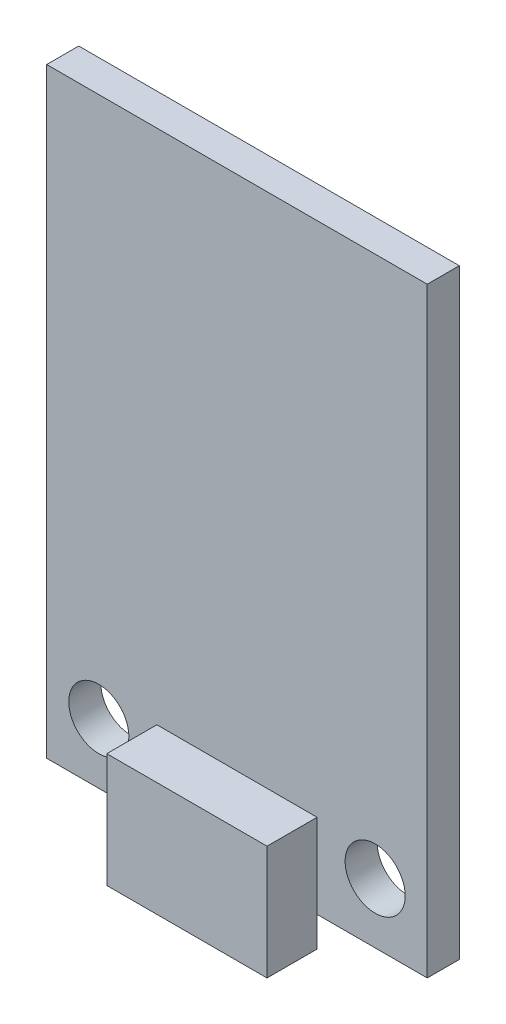
ISO-10303-21;
HEADER;
FILE_DESCRIPTION(('STEP AP214'),'2;1');
FILE_NAME('part.step','',(''),(''),'','','');
FILE_SCHEMA(('AUTOMOTIVE_DESIGN { 1 0 10303 214 1 1 1 1 }'));
ENDSEC;
DATA;
#1=APPLICATION_CONTEXT('core data for automotive mechanical design processes');
#2=APPLICATION_PROTOCOL_DEFINITION('international standard','automotive_design',2000,#1);
#3=PRODUCT_CONTEXT('',#1,'mechanical');
#4=PRODUCT('Part','Part','',(#3));
#5=PRODUCT_RELATED_PRODUCT_CATEGORY('part','',(#4));
#6=PRODUCT_DEFINITION_FORMATION('','',#4);
#7=PRODUCT_DEFINITION_CONTEXT('part definition',#1,'design');
#8=PRODUCT_DEFINITION('design','',#6,#7);
#9=PRODUCT_DEFINITION_SHAPE('','',#8);
#10=(LENGTH_UNIT() NAMED_UNIT(*) SI_UNIT(.MILLI.,.METRE.));
#11=(NAMED_UNIT(*) PLANE_ANGLE_UNIT() SI_UNIT($,.RADIAN.));
#12=(NAMED_UNIT(*) SI_UNIT($,.STERADIAN.) SOLID_ANGLE_UNIT());
#13=UNCERTAINTY_MEASURE_WITH_UNIT(LENGTH_MEASURE(1.E-05),#10,'distance_accuracy_value','');
#14=(GEOMETRIC_REPRESENTATION_CONTEXT(3) GLOBAL_UNCERTAINTY_ASSIGNED_CONTEXT((#13)) GLOBAL_UNIT_ASSIGNED_CONTEXT((#10,
#11,#12)) REPRESENTATION_CONTEXT('',''));
#15=CARTESIAN_POINT('',(0.,0.,0.));
#16=DIRECTION('',(0.,0.,1.));
#17=DIRECTION('',(1.,0.,0.));
#18=AXIS2_PLACEMENT_3D('',#15,#16,#17);
#19=CARTESIAN_POINT('',(0.,0.,1.6));
#20=DIRECTION('',(0.,0.,-1.));
#21=DIRECTION('',(-1.,0.,0.));
#22=AXIS2_PLACEMENT_3D('',#19,#20,#21);
#23=PLANE('',#22);
#24=CARTESIAN_POINT('',(16.4,3.,1.6));
#25=DIRECTION('',(0.,0.,1.));
#26=DIRECTION('',(1.,0.,0.));
#27=AXIS2_PLACEMENT_3D('',#24,#25,#26);
#28=CIRCLE('',#27,1.5);
#29=CARTESIAN_POINT('',(17.9,3.,1.6));
#30=VERTEX_POINT('',#29);
#31=EDGE_CURVE('E202',#30,#30,#28,.T.);
#32=ORIENTED_EDGE('',*,*,#31,.F.);
#33=EDGE_LOOP('',(#32));
#34=FACE_BOUND('',#33,.T.);
#35=CARTESIAN_POINT('',(2.6,3.,1.6));
#36=DIRECTION('',(0.,0.,1.));
#37=DIRECTION('',(-1.,0.,0.));
#38=AXIS2_PLACEMENT_3D('',#35,#36,#37);
#39=CIRCLE('',#38,1.5);
#40=CARTESIAN_POINT('',(1.1,3.,1.6));
#41=VERTEX_POINT('',#40);
#42=EDGE_CURVE('E209',#41,#41,#39,.T.);
#43=ORIENTED_EDGE('',*,*,#42,.F.);
#44=EDGE_LOOP('',(#43));
#45=FACE_BOUND('',#44,.T.);
#46=DIRECTION('',(0.,-1.,0.));
#47=VECTOR('',#46,1.);
#48=CARTESIAN_POINT('',(5.5,4.2,1.6));
#49=LINE('',#48,#47);
#50=CARTESIAN_POINT('',(5.5,4.2,1.6));
#51=VERTEX_POINT('',#50);
#52=CARTESIAN_POINT('',(5.5,0.,1.6));
#53=VERTEX_POINT('',#52);
#54=EDGE_CURVE('E52',#51,#53,#49,.T.);
#55=ORIENTED_EDGE('',*,*,#54,.F.);
#56=DIRECTION('',(-1.,0.,0.));
#57=VECTOR('',#56,1.);
#58=CARTESIAN_POINT('',(5.5,4.2,1.6));
#59=LINE('',#58,#57);
#60=CARTESIAN_POINT('',(13.5,4.2,1.6));
#61=VERTEX_POINT('',#60);
#62=EDGE_CURVE('E125',#61,#51,#59,.T.);
#63=ORIENTED_EDGE('',*,*,#62,.F.);
#64=DIRECTION('',(0.,1.,0.));
#65=VECTOR('',#64,1.);
#66=CARTESIAN_POINT('',(13.5,4.2,1.6));
#67=LINE('',#66,#65);
#68=CARTESIAN_POINT('',(13.5,0.,1.6));
#69=VERTEX_POINT('',#68);
#70=EDGE_CURVE('E11',#69,#61,#67,.T.);
#71=ORIENTED_EDGE('',*,*,#70,.F.);
#72=DIRECTION('',(1.,0.,0.));
#73=VECTOR('',#72,1.);
#74=CARTESIAN_POINT('',(0.,0.,1.6));
#75=LINE('',#74,#73);
#76=CARTESIAN_POINT('',(19.,0.,1.6));
#77=VERTEX_POINT('',#76);
#78=EDGE_CURVE('E143',#69,#77,#75,.T.);
#79=ORIENTED_EDGE('',*,*,#78,.T.);
#80=DIRECTION('',(0.,1.,0.));
#81=VECTOR('',#80,1.);
#82=CARTESIAN_POINT('',(19.,0.,1.6));
#83=LINE('',#82,#81);
#84=CARTESIAN_POINT('',(19.,30.,1.6));
#85=VERTEX_POINT('',#84);
#86=EDGE_CURVE('E147',#77,#85,#83,.T.);
#87=ORIENTED_EDGE('',*,*,#86,.T.);
#88=DIRECTION('',(-1.,0.,0.));
#89=VECTOR('',#88,1.);
#90=CARTESIAN_POINT('',(0.,30.,1.6));
#91=LINE('',#90,#89);
#92=CARTESIAN_POINT('',(0.,30.,1.6));
#93=VERTEX_POINT('',#92);
#94=EDGE_CURVE('E150',#85,#93,#91,.T.);
#95=ORIENTED_EDGE('',*,*,#94,.T.);
#96=DIRECTION('',(0.,-1.,0.));
#97=VECTOR('',#96,1.);
#98=CARTESIAN_POINT('',(0.,0.,1.6));
#99=LINE('',#98,#97);
#100=CARTESIAN_POINT('',(0.,0.,1.6));
#101=VERTEX_POINT('',#100);
#102=EDGE_CURVE('E140',#93,#101,#99,.T.);
#103=ORIENTED_EDGE('',*,*,#102,.T.);
#104=EDGE_CURVE('E145',#101,#53,#75,.T.);
#105=ORIENTED_EDGE('',*,*,#104,.T.);
#106=EDGE_LOOP('',(#55,#63,#71,#79,#87,#95,#103,#105));
#107=FACE_BOUND('',#106,.T.);
#108=ADVANCED_FACE('F35',(#34,#45,#107),#23,.F.);
#109=CARTESIAN_POINT('',(0.,0.,1.6));
#110=DIRECTION('',(1.,0.,0.));
#111=DIRECTION('',(0.,0.,-1.));
#112=AXIS2_PLACEMENT_3D('',#109,#110,#111);
#113=PLANE('',#112);
#114=DIRECTION('',(0.,-1.,0.));
#115=VECTOR('',#114,1.);
#116=CARTESIAN_POINT('',(0.,0.,0.));
#117=LINE('',#116,#115);
#118=CARTESIAN_POINT('',(0.,30.,0.));
#119=VERTEX_POINT('',#118);
#120=CARTESIAN_POINT('',(0.,0.,0.));
#121=VERTEX_POINT('',#120);
#122=EDGE_CURVE('E131',#119,#121,#117,.T.);
#123=ORIENTED_EDGE('',*,*,#122,.T.);
#124=DIRECTION('',(0.,0.,-1.));
#125=VECTOR('',#124,1.);
#126=CARTESIAN_POINT('',(0.,0.,1.6));
#127=LINE('',#126,#125);
#128=EDGE_CURVE('E39',#101,#121,#127,.T.);
#129=ORIENTED_EDGE('',*,*,#128,.F.);
#130=ORIENTED_EDGE('',*,*,#102,.F.);
#131=DIRECTION('',(0.,0.,-1.));
#132=VECTOR('',#131,1.);
#133=CARTESIAN_POINT('',(0.,30.,1.6));
#134=LINE('',#133,#132);
#135=EDGE_CURVE('E151',#93,#119,#134,.T.);
#136=ORIENTED_EDGE('',*,*,#135,.T.);
#137=EDGE_LOOP('',(#123,#129,#130,#136));
#138=FACE_BOUND('',#137,.T.);
#139=ADVANCED_FACE('F37',(#138),#113,.F.);
#140=CARTESIAN_POINT('',(0.,0.,1.6));
#141=DIRECTION('',(0.,1.,0.));
#142=DIRECTION('',(0.,0.,1.));
#143=AXIS2_PLACEMENT_3D('',#140,#141,#142);
#144=PLANE('',#143);
#145=DIRECTION('',(1.,0.,0.));
#146=VECTOR('',#145,1.);
#147=CARTESIAN_POINT('',(0.,0.,0.));
#148=LINE('',#147,#146);
#149=CARTESIAN_POINT('',(19.,0.,0.));
#150=VERTEX_POINT('',#149);
#151=EDGE_CURVE('E134',#121,#150,#148,.T.);
#152=ORIENTED_EDGE('',*,*,#151,.T.);
#153=DIRECTION('',(0.,0.,-1.));
#154=VECTOR('',#153,1.);
#155=CARTESIAN_POINT('',(19.,0.,1.6));
#156=LINE('',#155,#154);
#157=EDGE_CURVE('E161',#77,#150,#156,.T.);
#158=ORIENTED_EDGE('',*,*,#157,.F.);
#159=ORIENTED_EDGE('',*,*,#78,.F.);
#160=EDGE_CURVE('E148',#53,#69,#75,.T.);
#161=ORIENTED_EDGE('',*,*,#160,.F.);
#162=ORIENTED_EDGE('',*,*,#104,.F.);
#163=ORIENTED_EDGE('',*,*,#128,.T.);
#164=EDGE_LOOP('',(#152,#158,#159,#161,#162,#163));
#165=FACE_BOUND('',#164,.T.);
#166=ADVANCED_FACE('F170',(#165),#144,.F.);
#167=CARTESIAN_POINT('',(19.,0.,1.6));
#168=DIRECTION('',(-1.,0.,0.));
#169=DIRECTION('',(0.,0.,1.));
#170=AXIS2_PLACEMENT_3D('',#167,#168,#169);
#171=PLANE('',#170);
#172=DIRECTION('',(0.,1.,0.));
#173=VECTOR('',#172,1.);
#174=CARTESIAN_POINT('',(19.,0.,0.));
#175=LINE('',#174,#173);
#176=CARTESIAN_POINT('',(19.,30.,0.));
#177=VERTEX_POINT('',#176);
#178=EDGE_CURVE('E154',#150,#177,#175,.T.);
#179=ORIENTED_EDGE('',*,*,#178,.T.);
#180=DIRECTION('',(0.,0.,-1.));
#181=VECTOR('',#180,1.);
#182=CARTESIAN_POINT('',(19.,30.,1.6));
#183=LINE('',#182,#181);
#184=EDGE_CURVE('E159',#85,#177,#183,.T.);
#185=ORIENTED_EDGE('',*,*,#184,.F.);
#186=ORIENTED_EDGE('',*,*,#86,.F.);
#187=ORIENTED_EDGE('',*,*,#157,.T.);
#188=EDGE_LOOP('',(#179,#185,#186,#187));
#189=FACE_BOUND('',#188,.T.);
#190=ADVANCED_FACE('F179',(#189),#171,.F.);
#191=CARTESIAN_POINT('',(0.,30.,1.6));
#192=DIRECTION('',(0.,-1.,0.));
#193=DIRECTION('',(0.,0.,-1.));
#194=AXIS2_PLACEMENT_3D('',#191,#192,#193);
#195=PLANE('',#194);
#196=DIRECTION('',(-1.,0.,0.));
#197=VECTOR('',#196,1.);
#198=CARTESIAN_POINT('',(0.,30.,0.));
#199=LINE('',#198,#197);
#200=EDGE_CURVE('E144',#177,#119,#199,.T.);
#201=ORIENTED_EDGE('',*,*,#200,.T.);
#202=ORIENTED_EDGE('',*,*,#135,.F.);
#203=ORIENTED_EDGE('',*,*,#94,.F.);
#204=ORIENTED_EDGE('',*,*,#184,.T.);
#205=EDGE_LOOP('',(#201,#202,#203,#204));
#206=FACE_BOUND('',#205,.T.);
#207=ADVANCED_FACE('F182',(#206),#195,.F.);
#208=CARTESIAN_POINT('',(0.,0.,0.));
#209=DIRECTION('',(0.,0.,-1.));
#210=DIRECTION('',(-1.,0.,0.));
#211=AXIS2_PLACEMENT_3D('',#208,#209,#210);
#212=PLANE('',#211);
#213=CARTESIAN_POINT('',(16.4,3.,0.));
#214=DIRECTION('',(0.,0.,-1.));
#215=DIRECTION('',(-1.,0.,0.));
#216=AXIS2_PLACEMENT_3D('',#213,#214,#215);
#217=CIRCLE('',#216,1.5);
#218=CARTESIAN_POINT('',(14.9,3.,0.));
#219=VERTEX_POINT('',#218);
#220=EDGE_CURVE('E204',#219,#219,#217,.F.);
#221=ORIENTED_EDGE('',*,*,#220,.T.);
#222=EDGE_LOOP('',(#221));
#223=FACE_BOUND('',#222,.T.);
#224=CARTESIAN_POINT('',(2.6,3.,0.));
#225=DIRECTION('',(0.,0.,-1.));
#226=DIRECTION('',(-1.,0.,0.));
#227=AXIS2_PLACEMENT_3D('',#224,#225,#226);
#228=CIRCLE('',#227,1.5);
#229=CARTESIAN_POINT('',(1.1,3.,0.));
#230=VERTEX_POINT('',#229);
#231=EDGE_CURVE('E214',#230,#230,#228,.F.);
#232=ORIENTED_EDGE('',*,*,#231,.T.);
#233=EDGE_LOOP('',(#232));
#234=FACE_BOUND('',#233,.T.);
#235=ORIENTED_EDGE('',*,*,#122,.F.);
#236=ORIENTED_EDGE('',*,*,#200,.F.);
#237=ORIENTED_EDGE('',*,*,#178,.F.);
#238=ORIENTED_EDGE('',*,*,#151,.F.);
#239=EDGE_LOOP('',(#235,#236,#237,#238));
#240=FACE_BOUND('',#239,.T.);
#241=ADVANCED_FACE('F177',(#223,#234,#240),#212,.T.);
#242=CARTESIAN_POINT('',(0.,0.,1.6));
#243=DIRECTION('',(0.,0.,1.));
#244=DIRECTION('',(1.,0.,0.));
#245=AXIS2_PLACEMENT_3D('',#242,#243,#244);
#246=PLANE('',#245);
#247=CARTESIAN_POINT('',(5.5,-1.5,1.6));
#248=VERTEX_POINT('',#247);
#249=EDGE_CURVE('E129',#53,#248,#49,.T.);
#250=ORIENTED_EDGE('',*,*,#249,.F.);
#251=ORIENTED_EDGE('',*,*,#160,.T.);
#252=CARTESIAN_POINT('',(13.5,-1.5,1.6));
#253=VERTEX_POINT('',#252);
#254=EDGE_CURVE('E45',#253,#69,#67,.T.);
#255=ORIENTED_EDGE('',*,*,#254,.F.);
#256=DIRECTION('',(1.,0.,0.));
#257=VECTOR('',#256,1.);
#258=CARTESIAN_POINT('',(5.5,-1.5,1.6));
#259=LINE('',#258,#257);
#260=EDGE_CURVE('E192',#248,#253,#259,.T.);
#261=ORIENTED_EDGE('',*,*,#260,.F.);
#262=EDGE_LOOP('',(#250,#251,#255,#261));
#263=FACE_BOUND('',#262,.T.);
#264=ADVANCED_FACE('F187',(#263),#246,.F.);
#265=CARTESIAN_POINT('',(5.5,4.2,4.1));
#266=DIRECTION('',(1.,0.,0.));
#267=DIRECTION('',(0.,0.,-1.));
#268=AXIS2_PLACEMENT_3D('',#265,#266,#267);
#269=PLANE('',#268);
#270=ORIENTED_EDGE('',*,*,#54,.T.);
#271=ORIENTED_EDGE('',*,*,#249,.T.);
#272=DIRECTION('',(0.,0.,-1.));
#273=VECTOR('',#272,1.);
#274=CARTESIAN_POINT('',(5.5,-1.5,4.1));
#275=LINE('',#274,#273);
#276=CARTESIAN_POINT('',(5.5,-1.5,4.1));
#277=VERTEX_POINT('',#276);
#278=EDGE_CURVE('E110',#277,#248,#275,.T.);
#279=ORIENTED_EDGE('',*,*,#278,.F.);
#280=DIRECTION('',(0.,-1.,0.));
#281=VECTOR('',#280,1.);
#282=CARTESIAN_POINT('',(5.5,4.2,4.1));
#283=LINE('',#282,#281);
#284=CARTESIAN_POINT('',(5.5,4.2,4.1));
#285=VERTEX_POINT('',#284);
#286=EDGE_CURVE('E116',#285,#277,#283,.T.);
#287=ORIENTED_EDGE('',*,*,#286,.F.);
#288=DIRECTION('',(0.,0.,-1.));
#289=VECTOR('',#288,1.);
#290=CARTESIAN_POINT('',(5.5,4.2,4.1));
#291=LINE('',#290,#289);
#292=EDGE_CURVE('E197',#285,#51,#291,.T.);
#293=ORIENTED_EDGE('',*,*,#292,.T.);
#294=EDGE_LOOP('',(#270,#271,#279,#287,#293));
#295=FACE_BOUND('',#294,.T.);
#296=ADVANCED_FACE('F127',(#295),#269,.F.);
#297=CARTESIAN_POINT('',(5.5,-1.5,4.1));
#298=DIRECTION('',(0.,1.,0.));
#299=DIRECTION('',(0.,0.,1.));
#300=AXIS2_PLACEMENT_3D('',#297,#298,#299);
#301=PLANE('',#300);
#302=ORIENTED_EDGE('',*,*,#260,.T.);
#303=DIRECTION('',(0.,0.,-1.));
#304=VECTOR('',#303,1.);
#305=CARTESIAN_POINT('',(13.5,-1.5,4.1));
#306=LINE('',#305,#304);
#307=CARTESIAN_POINT('',(13.5,-1.5,4.1));
#308=VERTEX_POINT('',#307);
#309=EDGE_CURVE('E112',#308,#253,#306,.T.);
#310=ORIENTED_EDGE('',*,*,#309,.F.);
#311=DIRECTION('',(1.,0.,0.));
#312=VECTOR('',#311,1.);
#313=CARTESIAN_POINT('',(5.5,-1.5,4.1));
#314=LINE('',#313,#312);
#315=EDGE_CURVE('E106',#277,#308,#314,.T.);
#316=ORIENTED_EDGE('',*,*,#315,.F.);
#317=ORIENTED_EDGE('',*,*,#278,.T.);
#318=EDGE_LOOP('',(#302,#310,#316,#317));
#319=FACE_BOUND('',#318,.T.);
#320=ADVANCED_FACE('F108',(#319),#301,.F.);
#321=CARTESIAN_POINT('',(13.5,4.2,4.1));
#322=DIRECTION('',(-1.,0.,0.));
#323=DIRECTION('',(0.,0.,1.));
#324=AXIS2_PLACEMENT_3D('',#321,#322,#323);
#325=PLANE('',#324);
#326=ORIENTED_EDGE('',*,*,#254,.T.);
#327=ORIENTED_EDGE('',*,*,#70,.T.);
#328=DIRECTION('',(0.,0.,-1.));
#329=VECTOR('',#328,1.);
#330=CARTESIAN_POINT('',(13.5,4.2,4.1));
#331=LINE('',#330,#329);
#332=CARTESIAN_POINT('',(13.5,4.2,4.1));
#333=VERTEX_POINT('',#332);
#334=EDGE_CURVE('E136',#333,#61,#331,.T.);
#335=ORIENTED_EDGE('',*,*,#334,.F.);
#336=DIRECTION('',(0.,1.,0.));
#337=VECTOR('',#336,1.);
#338=CARTESIAN_POINT('',(13.5,4.2,4.1));
#339=LINE('',#338,#337);
#340=EDGE_CURVE('E115',#308,#333,#339,.T.);
#341=ORIENTED_EDGE('',*,*,#340,.F.);
#342=ORIENTED_EDGE('',*,*,#309,.T.);
#343=EDGE_LOOP('',(#326,#327,#335,#341,#342));
#344=FACE_BOUND('',#343,.T.);
#345=ADVANCED_FACE('F189',(#344),#325,.F.);
#346=CARTESIAN_POINT('',(5.5,4.2,4.1));
#347=DIRECTION('',(0.,-1.,0.));
#348=DIRECTION('',(0.,0.,-1.));
#349=AXIS2_PLACEMENT_3D('',#346,#347,#348);
#350=PLANE('',#349);
#351=ORIENTED_EDGE('',*,*,#62,.T.);
#352=ORIENTED_EDGE('',*,*,#292,.F.);
#353=DIRECTION('',(-1.,0.,0.));
#354=VECTOR('',#353,1.);
#355=CARTESIAN_POINT('',(5.5,4.2,4.1));
#356=LINE('',#355,#354);
#357=EDGE_CURVE('E121',#333,#285,#356,.T.);
#358=ORIENTED_EDGE('',*,*,#357,.F.);
#359=ORIENTED_EDGE('',*,*,#334,.T.);
#360=EDGE_LOOP('',(#351,#352,#358,#359));
#361=FACE_BOUND('',#360,.T.);
#362=ADVANCED_FACE('F199',(#361),#350,.F.);
#363=CARTESIAN_POINT('',(0.,0.,4.1));
#364=DIRECTION('',(0.,0.,1.));
#365=DIRECTION('',(1.,0.,0.));
#366=AXIS2_PLACEMENT_3D('',#363,#364,#365);
#367=PLANE('',#366);
#368=ORIENTED_EDGE('',*,*,#286,.T.);
#369=ORIENTED_EDGE('',*,*,#315,.T.);
#370=ORIENTED_EDGE('',*,*,#340,.T.);
#371=ORIENTED_EDGE('',*,*,#357,.T.);
#372=EDGE_LOOP('',(#368,#369,#370,#371));
#373=FACE_BOUND('',#372,.T.);
#374=ADVANCED_FACE('F119',(#373),#367,.T.);
#375=CARTESIAN_POINT('',(2.6,3.,-0.000999999999999916));
#376=DIRECTION('',(0.,0.,1.));
#377=DIRECTION('',(1.,0.,0.));
#378=AXIS2_PLACEMENT_3D('',#375,#376,#377);
#379=CYLINDRICAL_SURFACE('',#378,1.5);
#380=ORIENTED_EDGE('',*,*,#231,.F.);
#381=EDGE_LOOP('',(#380));
#382=FACE_BOUND('',#381,.T.);
#383=ORIENTED_EDGE('',*,*,#42,.T.);
#384=EDGE_LOOP('',(#383));
#385=FACE_BOUND('',#384,.T.);
#386=ADVANCED_FACE('F219',(#382,#385),#379,.F.);
#387=CARTESIAN_POINT('',(16.4,3.,-0.000999999999999916));
#388=DIRECTION('',(0.,0.,1.));
#389=DIRECTION('',(1.,0.,0.));
#390=AXIS2_PLACEMENT_3D('',#387,#388,#389);
#391=CYLINDRICAL_SURFACE('',#390,1.5);
#392=ORIENTED_EDGE('',*,*,#220,.F.);
#393=EDGE_LOOP('',(#392));
#394=FACE_BOUND('',#393,.T.);
#395=ORIENTED_EDGE('',*,*,#31,.T.);
#396=EDGE_LOOP('',(#395));
#397=FACE_BOUND('',#396,.T.);
#398=ADVANCED_FACE('F222',(#394,#397),#391,.F.);
#399=CLOSED_SHELL('',(#108,#139,#166,#190,#207,#241,#264,#296,#320,#345,#362,#374,#386,#398));
#400=MANIFOLD_SOLID_BREP('B2',#399);
#401=ADVANCED_BREP_SHAPE_REPRESENTATION('',(#18,#400),#14);
#402=SHAPE_DEFINITION_REPRESENTATION(#9,#401);
ENDSEC;
END-ISO-10303-21;
